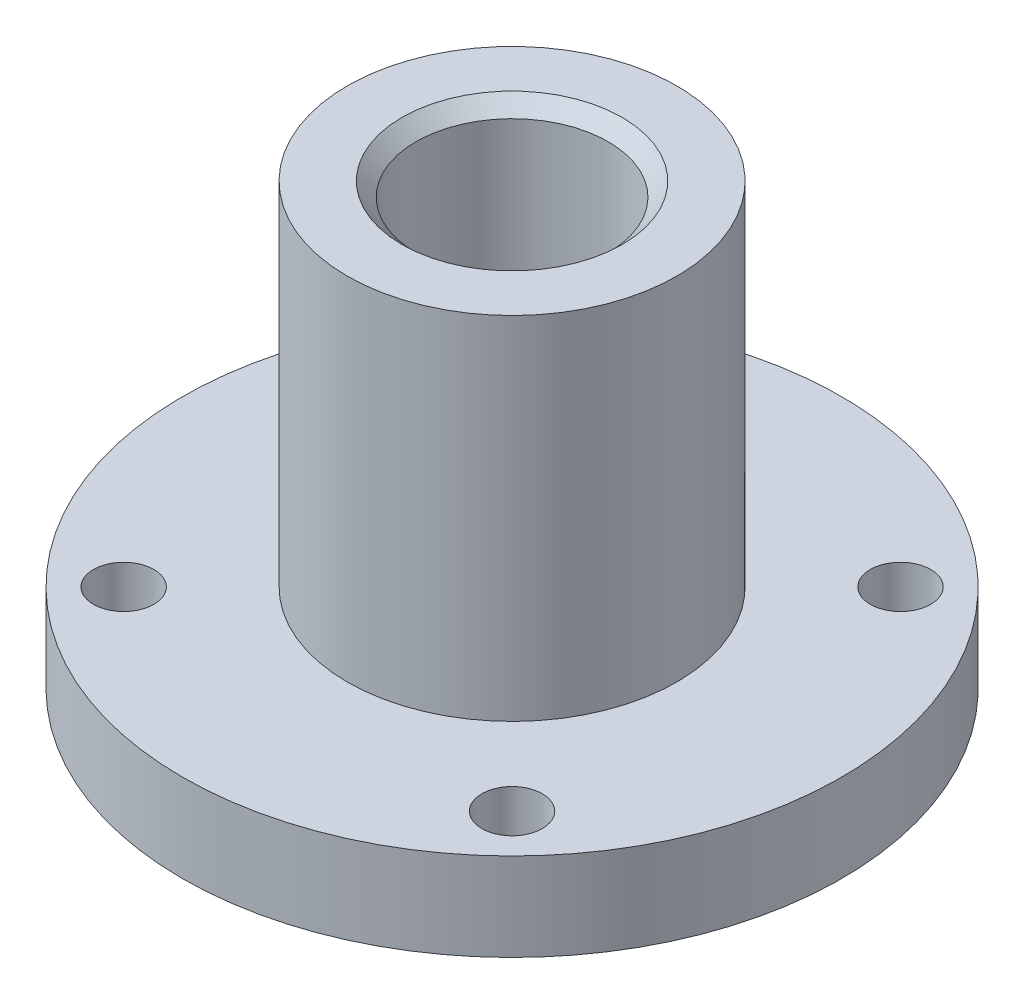
ISO-10303-21;
HEADER;
FILE_DESCRIPTION(('STEP AP214'),'2;1');
FILE_NAME('part.step','',(''),(''),'','','');
FILE_SCHEMA(('AUTOMOTIVE_DESIGN { 1 0 10303 214 1 1 1 1 }'));
ENDSEC;
DATA;
#1=APPLICATION_CONTEXT('core data for automotive mechanical design processes');
#2=APPLICATION_PROTOCOL_DEFINITION('international standard','automotive_design',2000,#1);
#3=PRODUCT_CONTEXT('',#1,'mechanical');
#4=PRODUCT('Part','Part','',(#3));
#5=PRODUCT_RELATED_PRODUCT_CATEGORY('part','',(#4));
#6=PRODUCT_DEFINITION_FORMATION('','',#4);
#7=PRODUCT_DEFINITION_CONTEXT('part definition',#1,'design');
#8=PRODUCT_DEFINITION('design','',#6,#7);
#9=PRODUCT_DEFINITION_SHAPE('','',#8);
#10=(LENGTH_UNIT() NAMED_UNIT(*) SI_UNIT(.MILLI.,.METRE.));
#11=(NAMED_UNIT(*) PLANE_ANGLE_UNIT() SI_UNIT($,.RADIAN.));
#12=(NAMED_UNIT(*) SI_UNIT($,.STERADIAN.) SOLID_ANGLE_UNIT());
#13=UNCERTAINTY_MEASURE_WITH_UNIT(LENGTH_MEASURE(1.E-05),#10,'distance_accuracy_value','');
#14=(GEOMETRIC_REPRESENTATION_CONTEXT(3) GLOBAL_UNCERTAINTY_ASSIGNED_CONTEXT((#13)) GLOBAL_UNIT_ASSIGNED_CONTEXT((#10,
#11,#12)) REPRESENTATION_CONTEXT('',''));
#15=CARTESIAN_POINT('',(0.,0.,0.));
#16=DIRECTION('',(0.,0.,1.));
#17=DIRECTION('',(1.,0.,0.));
#18=AXIS2_PLACEMENT_3D('',#15,#16,#17);
#19=CARTESIAN_POINT('',(0.,20.9834825920655,0.));
#20=DIRECTION('',(0.,1.,0.));
#21=DIRECTION('',(0.,0.,1.));
#22=AXIS2_PLACEMENT_3D('',#19,#20,#21);
#23=CYLINDRICAL_SURFACE('',#22,30.);
#24=CARTESIAN_POINT('',(0.,0.,0.));
#25=DIRECTION('',(0.,1.,0.));
#26=DIRECTION('',(0.,0.,1.));
#27=AXIS2_PLACEMENT_3D('',#24,#25,#26);
#28=CIRCLE('',#27,30.);
#29=CARTESIAN_POINT('',(0.,0.,30.));
#30=VERTEX_POINT('',#29);
#31=EDGE_CURVE('E60',#30,#30,#28,.T.);
#32=ORIENTED_EDGE('',*,*,#31,.T.);
#33=EDGE_LOOP('',(#32));
#34=FACE_BOUND('',#33,.T.);
#35=CARTESIAN_POINT('',(0.,8.00000000000001,0.));
#36=DIRECTION('',(0.,1.,0.));
#37=DIRECTION('',(0.,0.,1.));
#38=AXIS2_PLACEMENT_3D('',#35,#36,#37);
#39=CIRCLE('',#38,30.);
#40=CARTESIAN_POINT('',(0.,8.00000000000001,30.));
#41=VERTEX_POINT('',#40);
#42=EDGE_CURVE('E12',#41,#41,#39,.T.);
#43=ORIENTED_EDGE('',*,*,#42,.F.);
#44=EDGE_LOOP('',(#43));
#45=FACE_BOUND('',#44,.T.);
#46=ADVANCED_FACE('F46',(#34,#45),#23,.T.);
#47=CARTESIAN_POINT('',(30.,8.00000000000001,-2.22044604925031E-13));
#48=DIRECTION('',(0.,1.,0.));
#49=DIRECTION('',(0.,0.,1.));
#50=AXIS2_PLACEMENT_3D('',#47,#48,#49);
#51=PLANE('',#50);
#52=CARTESIAN_POINT('',(-17.6776695296636,8.00000000000001,17.6776695296638));
#53=DIRECTION('',(0.,1.,0.));
#54=DIRECTION('',(0.,0.,1.));
#55=AXIS2_PLACEMENT_3D('',#52,#53,#54);
#56=CIRCLE('',#55,2.75);
#57=CARTESIAN_POINT('',(-17.6776695296636,8.00000000000001,20.4276695296638));
#58=VERTEX_POINT('',#57);
#59=EDGE_CURVE('E88',#58,#58,#56,.T.);
#60=ORIENTED_EDGE('',*,*,#59,.F.);
#61=EDGE_LOOP('',(#60));
#62=FACE_BOUND('',#61,.T.);
#63=CARTESIAN_POINT('',(17.6776695296636,7.99999999999984,-17.6776695296638));
#64=DIRECTION('',(0.,1.,0.));
#65=DIRECTION('',(0.,0.,1.));
#66=AXIS2_PLACEMENT_3D('',#63,#64,#65);
#67=CIRCLE('',#66,2.75);
#68=CARTESIAN_POINT('',(17.6776695296636,7.99999999999984,-14.9276695296638));
#69=VERTEX_POINT('',#68);
#70=EDGE_CURVE('E81',#69,#69,#67,.T.);
#71=ORIENTED_EDGE('',*,*,#70,.F.);
#72=EDGE_LOOP('',(#71));
#73=FACE_BOUND('',#72,.T.);
#74=CARTESIAN_POINT('',(17.6776695296636,7.99999999999995,17.6776695296638));
#75=DIRECTION('',(0.,1.,0.));
#76=DIRECTION('',(0.,0.,1.));
#77=AXIS2_PLACEMENT_3D('',#74,#75,#76);
#78=CIRCLE('',#77,2.75);
#79=CARTESIAN_POINT('',(17.6776695296636,7.99999999999995,20.4276695296638));
#80=VERTEX_POINT('',#79);
#81=EDGE_CURVE('E93',#80,#80,#78,.T.);
#82=ORIENTED_EDGE('',*,*,#81,.F.);
#83=EDGE_LOOP('',(#82));
#84=FACE_BOUND('',#83,.T.);
#85=CARTESIAN_POINT('',(-17.6776695296636,8.00000000000001,-17.6776695296638));
#86=DIRECTION('',(0.,1.,0.));
#87=DIRECTION('',(0.,0.,1.));
#88=AXIS2_PLACEMENT_3D('',#85,#86,#87);
#89=CIRCLE('',#88,2.75);
#90=CARTESIAN_POINT('',(-17.6776695296636,8.00000000000001,-14.9276695296638));
#91=VERTEX_POINT('',#90);
#92=EDGE_CURVE('E75',#91,#91,#89,.T.);
#93=ORIENTED_EDGE('',*,*,#92,.F.);
#94=EDGE_LOOP('',(#93));
#95=FACE_BOUND('',#94,.T.);
#96=ORIENTED_EDGE('',*,*,#42,.T.);
#97=EDGE_LOOP('',(#96));
#98=FACE_BOUND('',#97,.T.);
#99=CARTESIAN_POINT('',(0.,8.00000000000001,0.));
#100=DIRECTION('',(0.,1.,0.));
#101=DIRECTION('',(0.,0.,1.));
#102=AXIS2_PLACEMENT_3D('',#99,#100,#101);
#103=CIRCLE('',#102,15.);
#104=CARTESIAN_POINT('',(0.,8.00000000000001,15.));
#105=VERTEX_POINT('',#104);
#106=EDGE_CURVE('E52',#105,#105,#103,.T.);
#107=ORIENTED_EDGE('',*,*,#106,.F.);
#108=EDGE_LOOP('',(#107));
#109=FACE_BOUND('',#108,.T.);
#110=ADVANCED_FACE('F110',(#62,#73,#84,#95,#98,#109),#51,.T.);
#111=CARTESIAN_POINT('',(0.,20.9834825920655,0.));
#112=DIRECTION('',(0.,1.,0.));
#113=DIRECTION('',(0.,0.,1.));
#114=AXIS2_PLACEMENT_3D('',#111,#112,#113);
#115=CYLINDRICAL_SURFACE('',#114,15.);
#116=ORIENTED_EDGE('',*,*,#106,.T.);
#117=EDGE_LOOP('',(#116));
#118=FACE_BOUND('',#117,.T.);
#119=CARTESIAN_POINT('',(0.,40.,0.));
#120=DIRECTION('',(0.,1.,0.));
#121=DIRECTION('',(0.,0.,1.));
#122=AXIS2_PLACEMENT_3D('',#119,#120,#121);
#123=CIRCLE('',#122,15.);
#124=CARTESIAN_POINT('',(0.,40.,15.));
#125=VERTEX_POINT('',#124);
#126=EDGE_CURVE('E56',#125,#125,#123,.T.);
#127=ORIENTED_EDGE('',*,*,#126,.F.);
#128=EDGE_LOOP('',(#127));
#129=FACE_BOUND('',#128,.T.);
#130=ADVANCED_FACE('F113',(#118,#129),#115,.T.);
#131=CARTESIAN_POINT('',(15.,40.,-1.11022302462516E-13));
#132=DIRECTION('',(0.,1.,0.));
#133=DIRECTION('',(0.,0.,1.));
#134=AXIS2_PLACEMENT_3D('',#131,#132,#133);
#135=PLANE('',#134);
#136=CARTESIAN_POINT('',(0.,40.,0.));
#137=DIRECTION('',(0.,1.,0.));
#138=DIRECTION('',(0.,0.,1.));
#139=AXIS2_PLACEMENT_3D('',#136,#137,#138);
#140=CIRCLE('',#139,10.025);
#141=CARTESIAN_POINT('',(0.,40.,10.025));
#142=VERTEX_POINT('',#141);
#143=EDGE_CURVE('E71',#142,#142,#140,.T.);
#144=ORIENTED_EDGE('',*,*,#143,.F.);
#145=EDGE_LOOP('',(#144));
#146=FACE_BOUND('',#145,.T.);
#147=ORIENTED_EDGE('',*,*,#126,.T.);
#148=EDGE_LOOP('',(#147));
#149=FACE_BOUND('',#148,.T.);
#150=ADVANCED_FACE('F138',(#146,#149),#135,.T.);
#151=CARTESIAN_POINT('',(0.,0.,0.));
#152=DIRECTION('',(0.,-1.,0.));
#153=DIRECTION('',(0.,0.,-1.));
#154=AXIS2_PLACEMENT_3D('',#151,#152,#153);
#155=PLANE('',#154);
#156=CARTESIAN_POINT('',(-17.6776695296636,0.,17.6776695296638));
#157=DIRECTION('',(0.,1.,0.));
#158=DIRECTION('',(0.,0.,1.));
#159=AXIS2_PLACEMENT_3D('',#156,#157,#158);
#160=CIRCLE('',#159,2.75);
#161=CARTESIAN_POINT('',(-17.6776695296636,0.,20.4276695296638));
#162=VERTEX_POINT('',#161);
#163=EDGE_CURVE('E78',#162,#162,#160,.T.);
#164=ORIENTED_EDGE('',*,*,#163,.T.);
#165=EDGE_LOOP('',(#164));
#166=FACE_BOUND('',#165,.T.);
#167=CARTESIAN_POINT('',(17.6776695296636,-1.66533453693773E-13,-17.6776695296638));
#168=DIRECTION('',(0.,1.,0.));
#169=DIRECTION('',(0.,0.,1.));
#170=AXIS2_PLACEMENT_3D('',#167,#168,#169);
#171=CIRCLE('',#170,2.75);
#172=CARTESIAN_POINT('',(17.6776695296636,-1.66533453693773E-13,-14.9276695296638));
#173=VERTEX_POINT('',#172);
#174=EDGE_CURVE('E84',#173,#173,#171,.T.);
#175=ORIENTED_EDGE('',*,*,#174,.T.);
#176=EDGE_LOOP('',(#175));
#177=FACE_BOUND('',#176,.T.);
#178=CARTESIAN_POINT('',(17.6776695296636,0.,17.6776695296638));
#179=DIRECTION('',(0.,1.,0.));
#180=DIRECTION('',(0.,0.,1.));
#181=AXIS2_PLACEMENT_3D('',#178,#179,#180);
#182=CIRCLE('',#181,2.75);
#183=CARTESIAN_POINT('',(17.6776695296636,0.,20.4276695296638));
#184=VERTEX_POINT('',#183);
#185=EDGE_CURVE('E85',#184,#184,#182,.T.);
#186=ORIENTED_EDGE('',*,*,#185,.T.);
#187=EDGE_LOOP('',(#186));
#188=FACE_BOUND('',#187,.T.);
#189=CARTESIAN_POINT('',(-17.6776695296636,0.,-17.6776695296638));
#190=DIRECTION('',(0.,1.,0.));
#191=DIRECTION('',(0.,0.,1.));
#192=AXIS2_PLACEMENT_3D('',#189,#190,#191);
#193=CIRCLE('',#192,2.75);
#194=CARTESIAN_POINT('',(-17.6776695296636,0.,-14.9276695296638));
#195=VERTEX_POINT('',#194);
#196=EDGE_CURVE('E74',#195,#195,#193,.T.);
#197=ORIENTED_EDGE('',*,*,#196,.T.);
#198=EDGE_LOOP('',(#197));
#199=FACE_BOUND('',#198,.T.);
#200=CARTESIAN_POINT('',(0.,0.,0.));
#201=DIRECTION('',(0.,1.,0.));
#202=DIRECTION('',(0.,0.,1.));
#203=AXIS2_PLACEMENT_3D('',#200,#201,#202);
#204=CIRCLE('',#203,8.75);
#205=CARTESIAN_POINT('',(0.,0.,8.75));
#206=VERTEX_POINT('',#205);
#207=EDGE_CURVE('E65',#206,#206,#204,.T.);
#208=ORIENTED_EDGE('',*,*,#207,.T.);
#209=EDGE_LOOP('',(#208));
#210=FACE_BOUND('',#209,.T.);
#211=ORIENTED_EDGE('',*,*,#31,.F.);
#212=EDGE_LOOP('',(#211));
#213=FACE_BOUND('',#212,.T.);
#214=ADVANCED_FACE('F99',(#166,#177,#188,#199,#210,#213),#155,.T.);
#215=CARTESIAN_POINT('',(0.,40.,0.));
#216=DIRECTION('',(0.,1.,0.));
#217=DIRECTION('',(0.,0.,1.));
#218=AXIS2_PLACEMENT_3D('',#215,#216,#217);
#219=CYLINDRICAL_SURFACE('',#218,8.75);
#220=ORIENTED_EDGE('',*,*,#207,.F.);
#221=EDGE_LOOP('',(#220));
#222=FACE_BOUND('',#221,.T.);
#223=CARTESIAN_POINT('',(0.,38.725,0.));
#224=DIRECTION('',(0.,1.,0.));
#225=DIRECTION('',(0.,0.,1.));
#226=AXIS2_PLACEMENT_3D('',#223,#224,#225);
#227=CIRCLE('',#226,8.75);
#228=CARTESIAN_POINT('',(0.,38.725,8.75));
#229=VERTEX_POINT('',#228);
#230=EDGE_CURVE('E68',#229,#229,#227,.T.);
#231=ORIENTED_EDGE('',*,*,#230,.T.);
#232=EDGE_LOOP('',(#231));
#233=FACE_BOUND('',#232,.T.);
#234=ADVANCED_FACE('F125',(#222,#233),#219,.F.);
#235=CARTESIAN_POINT('',(0.,40.,0.));
#236=DIRECTION('',(0.,1.,0.));
#237=DIRECTION('',(0.,0.,1.));
#238=AXIS2_PLACEMENT_3D('',#235,#236,#237);
#239=CONICAL_SURFACE('',#238,10.025,0.785398163397452);
#240=ORIENTED_EDGE('',*,*,#230,.F.);
#241=EDGE_LOOP('',(#240));
#242=FACE_BOUND('',#241,.T.);
#243=ORIENTED_EDGE('',*,*,#143,.T.);
#244=EDGE_LOOP('',(#243));
#245=FACE_BOUND('',#244,.T.);
#246=ADVANCED_FACE('F119',(#242,#245),#239,.F.);
#247=CARTESIAN_POINT('',(-17.6776695296636,0.,-17.6776695296638));
#248=DIRECTION('',(0.,1.,0.));
#249=DIRECTION('',(0.,0.,1.));
#250=AXIS2_PLACEMENT_3D('',#247,#248,#249);
#251=CYLINDRICAL_SURFACE('',#250,2.75);
#252=ORIENTED_EDGE('',*,*,#196,.F.);
#253=EDGE_LOOP('',(#252));
#254=FACE_BOUND('',#253,.T.);
#255=ORIENTED_EDGE('',*,*,#92,.T.);
#256=EDGE_LOOP('',(#255));
#257=FACE_BOUND('',#256,.T.);
#258=ADVANCED_FACE('F106',(#254,#257),#251,.F.);
#259=CARTESIAN_POINT('',(17.6776695296636,0.,17.6776695296638));
#260=DIRECTION('',(0.,1.,0.));
#261=DIRECTION('',(0.,0.,1.));
#262=AXIS2_PLACEMENT_3D('',#259,#260,#261);
#263=CYLINDRICAL_SURFACE('',#262,2.75);
#264=ORIENTED_EDGE('',*,*,#185,.F.);
#265=EDGE_LOOP('',(#264));
#266=FACE_BOUND('',#265,.T.);
#267=ORIENTED_EDGE('',*,*,#81,.T.);
#268=EDGE_LOOP('',(#267));
#269=FACE_BOUND('',#268,.T.);
#270=ADVANCED_FACE('F102',(#266,#269),#263,.F.);
#271=CARTESIAN_POINT('',(17.6776695296636,-1.66533453693773E-13,-17.6776695296638));
#272=DIRECTION('',(0.,1.,0.));
#273=DIRECTION('',(0.,0.,1.));
#274=AXIS2_PLACEMENT_3D('',#271,#272,#273);
#275=CYLINDRICAL_SURFACE('',#274,2.75);
#276=ORIENTED_EDGE('',*,*,#174,.F.);
#277=EDGE_LOOP('',(#276));
#278=FACE_BOUND('',#277,.T.);
#279=ORIENTED_EDGE('',*,*,#70,.T.);
#280=EDGE_LOOP('',(#279));
#281=FACE_BOUND('',#280,.T.);
#282=ADVANCED_FACE('F105',(#278,#281),#275,.F.);
#283=CARTESIAN_POINT('',(-17.6776695296636,0.,17.6776695296638));
#284=DIRECTION('',(0.,1.,0.));
#285=DIRECTION('',(0.,0.,1.));
#286=AXIS2_PLACEMENT_3D('',#283,#284,#285);
#287=CYLINDRICAL_SURFACE('',#286,2.75);
#288=ORIENTED_EDGE('',*,*,#163,.F.);
#289=EDGE_LOOP('',(#288));
#290=FACE_BOUND('',#289,.T.);
#291=ORIENTED_EDGE('',*,*,#59,.T.);
#292=EDGE_LOOP('',(#291));
#293=FACE_BOUND('',#292,.T.);
#294=ADVANCED_FACE('F187',(#290,#293),#287,.F.);
#295=CLOSED_SHELL('',(#46,#110,#130,#150,#214,#234,#246,#258,#270,#282,#294));
#296=MANIFOLD_SOLID_BREP('B2',#295);
#297=ADVANCED_BREP_SHAPE_REPRESENTATION('',(#18,#296),#14);
#298=SHAPE_DEFINITION_REPRESENTATION(#9,#297);
ENDSEC;
END-ISO-10303-21;
